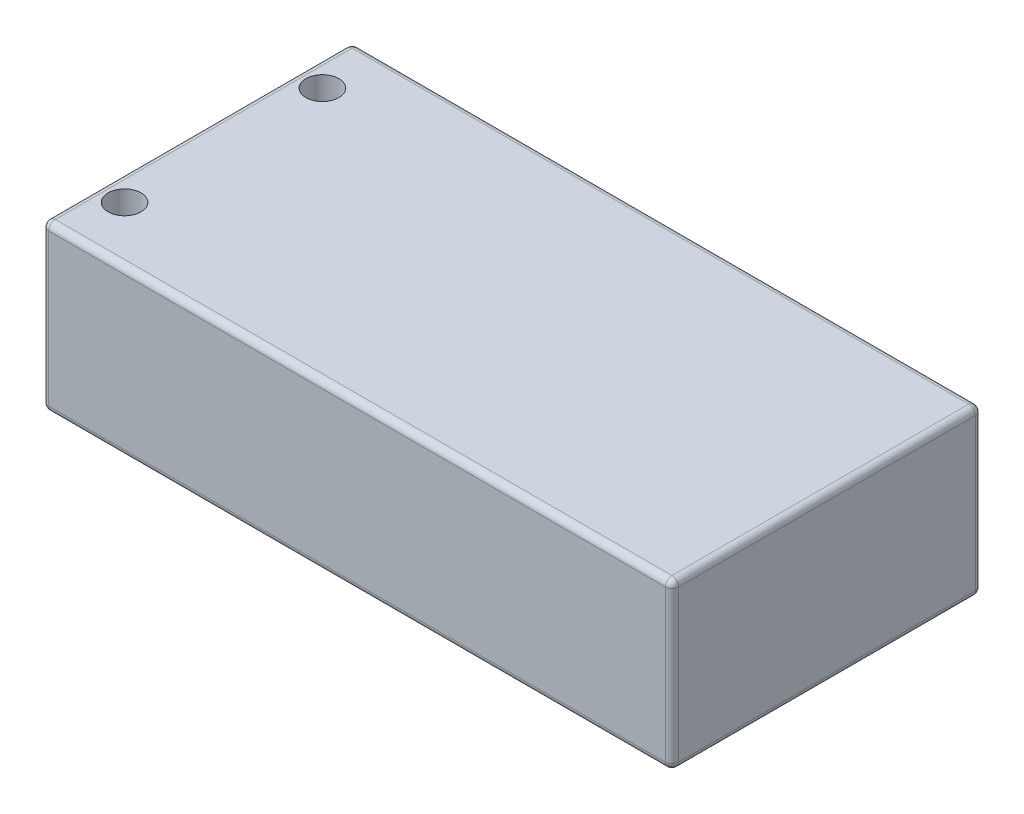
ISO-10303-21;
HEADER;
FILE_DESCRIPTION(('STEP AP214'),'2;1');
FILE_NAME('part.step','',(''),(''),'','','');
FILE_SCHEMA(('AUTOMOTIVE_DESIGN { 1 0 10303 214 1 1 1 1 }'));
ENDSEC;
DATA;
#1=APPLICATION_CONTEXT('core data for automotive mechanical design processes');
#2=APPLICATION_PROTOCOL_DEFINITION('international standard','automotive_design',2000,#1);
#3=PRODUCT_CONTEXT('',#1,'mechanical');
#4=PRODUCT('Part','Part','',(#3));
#5=PRODUCT_RELATED_PRODUCT_CATEGORY('part','',(#4));
#6=PRODUCT_DEFINITION_FORMATION('','',#4);
#7=PRODUCT_DEFINITION_CONTEXT('part definition',#1,'design');
#8=PRODUCT_DEFINITION('design','',#6,#7);
#9=PRODUCT_DEFINITION_SHAPE('','',#8);
#10=(LENGTH_UNIT() NAMED_UNIT(*) SI_UNIT(.MILLI.,.METRE.));
#11=(NAMED_UNIT(*) PLANE_ANGLE_UNIT() SI_UNIT($,.RADIAN.));
#12=(NAMED_UNIT(*) SI_UNIT($,.STERADIAN.) SOLID_ANGLE_UNIT());
#13=UNCERTAINTY_MEASURE_WITH_UNIT(LENGTH_MEASURE(1.E-05),#10,'distance_accuracy_value','');
#14=(GEOMETRIC_REPRESENTATION_CONTEXT(3) GLOBAL_UNCERTAINTY_ASSIGNED_CONTEXT((#13)) GLOBAL_UNIT_ASSIGNED_CONTEXT((#10,
#11,#12)) REPRESENTATION_CONTEXT('',''));
#15=CARTESIAN_POINT('',(0.,0.,0.));
#16=DIRECTION('',(0.,0.,1.));
#17=DIRECTION('',(1.,0.,0.));
#18=AXIS2_PLACEMENT_3D('',#15,#16,#17);
#19=CARTESIAN_POINT('',(47.75,25.,23.5));
#20=DIRECTION('',(-1.,0.,0.));
#21=DIRECTION('',(0.,0.,1.));
#22=AXIS2_PLACEMENT_3D('',#19,#20,#21);
#23=PLANE('',#22);
#24=DIRECTION('',(0.,0.,-1.));
#25=VECTOR('',#24,1.);
#26=CARTESIAN_POINT('',(47.75,24.,23.5));
#27=LINE('',#26,#25);
#28=CARTESIAN_POINT('',(47.75,24.,-22.5));
#29=VERTEX_POINT('',#28);
#30=CARTESIAN_POINT('',(47.75,24.,22.5));
#31=VERTEX_POINT('',#30);
#32=EDGE_CURVE('E253',#29,#31,#27,.F.);
#33=ORIENTED_EDGE('',*,*,#32,.T.);
#34=DIRECTION('',(0.,-1.,0.));
#35=VECTOR('',#34,1.);
#36=CARTESIAN_POINT('',(47.75,25.,22.5));
#37=LINE('',#36,#35);
#38=CARTESIAN_POINT('',(47.75,1.,22.5));
#39=VERTEX_POINT('',#38);
#40=EDGE_CURVE('E257',#31,#39,#37,.T.);
#41=ORIENTED_EDGE('',*,*,#40,.T.);
#42=DIRECTION('',(0.,0.,-1.));
#43=VECTOR('',#42,1.);
#44=CARTESIAN_POINT('',(47.75,1.,-23.5));
#45=LINE('',#44,#43);
#46=CARTESIAN_POINT('',(47.75,1.,-22.5));
#47=VERTEX_POINT('',#46);
#48=EDGE_CURVE('E250',#39,#47,#45,.T.);
#49=ORIENTED_EDGE('',*,*,#48,.T.);
#50=DIRECTION('',(0.,-1.,0.));
#51=VECTOR('',#50,1.);
#52=CARTESIAN_POINT('',(47.75,25.,-22.5));
#53=LINE('',#52,#51);
#54=EDGE_CURVE('E247',#47,#29,#53,.F.);
#55=ORIENTED_EDGE('',*,*,#54,.T.);
#56=EDGE_LOOP('',(#33,#41,#49,#55));
#57=FACE_BOUND('',#56,.T.);
#58=ADVANCED_FACE('F38',(#57),#23,.F.);
#59=CARTESIAN_POINT('',(-47.75,25.,-23.5));
#60=DIRECTION('',(0.,0.,1.));
#61=DIRECTION('',(1.,0.,0.));
#62=AXIS2_PLACEMENT_3D('',#59,#60,#61);
#63=PLANE('',#62);
#64=DIRECTION('',(-1.,0.,0.));
#65=VECTOR('',#64,1.);
#66=CARTESIAN_POINT('',(-47.75,24.,-23.5));
#67=LINE('',#66,#65);
#68=CARTESIAN_POINT('',(-46.75,24.,-23.5));
#69=VERTEX_POINT('',#68);
#70=CARTESIAN_POINT('',(46.75,24.,-23.5));
#71=VERTEX_POINT('',#70);
#72=EDGE_CURVE('E163',#69,#71,#67,.F.);
#73=ORIENTED_EDGE('',*,*,#72,.T.);
#74=DIRECTION('',(0.,-1.,0.));
#75=VECTOR('',#74,1.);
#76=CARTESIAN_POINT('',(46.75,25.,-23.5));
#77=LINE('',#76,#75);
#78=CARTESIAN_POINT('',(46.75,1.,-23.5));
#79=VERTEX_POINT('',#78);
#80=EDGE_CURVE('E294',#71,#79,#77,.T.);
#81=ORIENTED_EDGE('',*,*,#80,.T.);
#82=DIRECTION('',(-1.,0.,0.));
#83=VECTOR('',#82,1.);
#84=CARTESIAN_POINT('',(-47.75,1.,-23.5));
#85=LINE('',#84,#83);
#86=CARTESIAN_POINT('',(-46.75,1.,-23.5));
#87=VERTEX_POINT('',#86);
#88=EDGE_CURVE('E289',#79,#87,#85,.T.);
#89=ORIENTED_EDGE('',*,*,#88,.T.);
#90=DIRECTION('',(0.,-1.,0.));
#91=VECTOR('',#90,1.);
#92=CARTESIAN_POINT('',(-46.75,25.,-23.5));
#93=LINE('',#92,#91);
#94=EDGE_CURVE('E286',#87,#69,#93,.F.);
#95=ORIENTED_EDGE('',*,*,#94,.T.);
#96=EDGE_LOOP('',(#73,#81,#89,#95));
#97=FACE_BOUND('',#96,.T.);
#98=ADVANCED_FACE('F349',(#97),#63,.F.);
#99=CARTESIAN_POINT('',(-47.75,25.,23.5));
#100=DIRECTION('',(1.,0.,0.));
#101=DIRECTION('',(0.,0.,-1.));
#102=AXIS2_PLACEMENT_3D('',#99,#100,#101);
#103=PLANE('',#102);
#104=DIRECTION('',(0.,0.,1.));
#105=VECTOR('',#104,1.);
#106=CARTESIAN_POINT('',(-47.75,24.,23.5));
#107=LINE('',#106,#105);
#108=CARTESIAN_POINT('',(-47.75,24.,22.5));
#109=VERTEX_POINT('',#108);
#110=CARTESIAN_POINT('',(-47.75,24.,-22.5));
#111=VERTEX_POINT('',#110);
#112=EDGE_CURVE('E48',#109,#111,#107,.F.);
#113=ORIENTED_EDGE('',*,*,#112,.T.);
#114=DIRECTION('',(0.,-1.,0.));
#115=VECTOR('',#114,1.);
#116=CARTESIAN_POINT('',(-47.75,25.,-22.5));
#117=LINE('',#116,#115);
#118=CARTESIAN_POINT('',(-47.75,1.,-22.5));
#119=VERTEX_POINT('',#118);
#120=EDGE_CURVE('E11',#111,#119,#117,.T.);
#121=ORIENTED_EDGE('',*,*,#120,.T.);
#122=DIRECTION('',(0.,0.,1.));
#123=VECTOR('',#122,1.);
#124=CARTESIAN_POINT('',(-47.75,1.,23.5));
#125=LINE('',#124,#123);
#126=CARTESIAN_POINT('',(-47.75,1.,22.5));
#127=VERTEX_POINT('',#126);
#128=EDGE_CURVE('E298',#119,#127,#125,.T.);
#129=ORIENTED_EDGE('',*,*,#128,.T.);
#130=DIRECTION('',(0.,-1.,0.));
#131=VECTOR('',#130,1.);
#132=CARTESIAN_POINT('',(-47.75,25.,22.5));
#133=LINE('',#132,#131);
#134=EDGE_CURVE('E59',#127,#109,#133,.F.);
#135=ORIENTED_EDGE('',*,*,#134,.T.);
#136=EDGE_LOOP('',(#113,#121,#129,#135));
#137=FACE_BOUND('',#136,.T.);
#138=ADVANCED_FACE('F354',(#137),#103,.F.);
#139=CARTESIAN_POINT('',(-47.75,25.,23.5));
#140=DIRECTION('',(0.,0.,-1.));
#141=DIRECTION('',(-1.,0.,0.));
#142=AXIS2_PLACEMENT_3D('',#139,#140,#141);
#143=PLANE('',#142);
#144=DIRECTION('',(0.,-1.,0.));
#145=VECTOR('',#144,1.);
#146=CARTESIAN_POINT('',(46.75,25.,23.5));
#147=LINE('',#146,#145);
#148=CARTESIAN_POINT('',(46.75,1.,23.5));
#149=VERTEX_POINT('',#148);
#150=CARTESIAN_POINT('',(46.75,24.,23.5));
#151=VERTEX_POINT('',#150);
#152=EDGE_CURVE('E279',#149,#151,#147,.F.);
#153=ORIENTED_EDGE('',*,*,#152,.T.);
#154=DIRECTION('',(1.,0.,0.));
#155=VECTOR('',#154,1.);
#156=CARTESIAN_POINT('',(-47.75,24.,23.5));
#157=LINE('',#156,#155);
#158=CARTESIAN_POINT('',(-46.75,24.,23.5));
#159=VERTEX_POINT('',#158);
#160=EDGE_CURVE('E282',#151,#159,#157,.F.);
#161=ORIENTED_EDGE('',*,*,#160,.T.);
#162=DIRECTION('',(0.,-1.,0.));
#163=VECTOR('',#162,1.);
#164=CARTESIAN_POINT('',(-46.75,25.,23.5));
#165=LINE('',#164,#163);
#166=CARTESIAN_POINT('',(-46.75,1.,23.5));
#167=VERTEX_POINT('',#166);
#168=EDGE_CURVE('E273',#159,#167,#165,.T.);
#169=ORIENTED_EDGE('',*,*,#168,.T.);
#170=DIRECTION('',(1.,0.,0.));
#171=VECTOR('',#170,1.);
#172=CARTESIAN_POINT('',(47.75,1.,23.5));
#173=LINE('',#172,#171);
#174=EDGE_CURVE('E276',#167,#149,#173,.T.);
#175=ORIENTED_EDGE('',*,*,#174,.T.);
#176=EDGE_LOOP('',(#153,#161,#169,#175));
#177=FACE_BOUND('',#176,.T.);
#178=ADVANCED_FACE('F370',(#177),#143,.F.);
#179=CARTESIAN_POINT('',(0.,25.,0.));
#180=DIRECTION('',(0.,-1.,0.));
#181=DIRECTION('',(0.,0.,-1.));
#182=AXIS2_PLACEMENT_3D('',#179,#180,#181);
#183=PLANE('',#182);
#184=DIRECTION('',(1.,0.,0.));
#185=VECTOR('',#184,1.);
#186=CARTESIAN_POINT('',(0.,25.,22.5));
#187=LINE('',#186,#185);
#188=CARTESIAN_POINT('',(-46.75,25.,22.5));
#189=VERTEX_POINT('',#188);
#190=CARTESIAN_POINT('',(46.75,25.,22.5));
#191=VERTEX_POINT('',#190);
#192=EDGE_CURVE('E139',#189,#191,#187,.T.);
#193=ORIENTED_EDGE('',*,*,#192,.T.);
#194=DIRECTION('',(0.,0.,-1.));
#195=VECTOR('',#194,1.);
#196=CARTESIAN_POINT('',(46.75,25.,0.));
#197=LINE('',#196,#195);
#198=CARTESIAN_POINT('',(46.75,25.,-22.5));
#199=VERTEX_POINT('',#198);
#200=EDGE_CURVE('E134',#191,#199,#197,.T.);
#201=ORIENTED_EDGE('',*,*,#200,.T.);
#202=DIRECTION('',(-1.,0.,0.));
#203=VECTOR('',#202,1.);
#204=CARTESIAN_POINT('',(0.,25.,-22.5));
#205=LINE('',#204,#203);
#206=CARTESIAN_POINT('',(-46.75,25.,-22.5));
#207=VERTEX_POINT('',#206);
#208=EDGE_CURVE('E127',#199,#207,#205,.T.);
#209=ORIENTED_EDGE('',*,*,#208,.T.);
#210=DIRECTION('',(0.,0.,1.));
#211=VECTOR('',#210,1.);
#212=CARTESIAN_POINT('',(-46.75,25.,0.));
#213=LINE('',#212,#211);
#214=EDGE_CURVE('E131',#207,#189,#213,.T.);
#215=ORIENTED_EDGE('',*,*,#214,.T.);
#216=EDGE_LOOP('',(#193,#201,#209,#215));
#217=FACE_BOUND('',#216,.T.);
#218=CARTESIAN_POINT('',(-43.75,25.,-15.));
#219=DIRECTION('',(0.,1.,0.));
#220=DIRECTION('',(0.,0.,1.));
#221=AXIS2_PLACEMENT_3D('',#218,#219,#220);
#222=CIRCLE('',#221,2.5);
#223=CARTESIAN_POINT('',(-43.75,25.,-12.5));
#224=VERTEX_POINT('',#223);
#225=EDGE_CURVE('E239',#224,#224,#222,.T.);
#226=ORIENTED_EDGE('',*,*,#225,.F.);
#227=EDGE_LOOP('',(#226));
#228=FACE_BOUND('',#227,.T.);
#229=CARTESIAN_POINT('',(-43.75,25.,15.));
#230=DIRECTION('',(0.,1.,0.));
#231=DIRECTION('',(0.,0.,1.));
#232=AXIS2_PLACEMENT_3D('',#229,#230,#231);
#233=CIRCLE('',#232,2.5);
#234=CARTESIAN_POINT('',(-43.75,25.,17.5));
#235=VERTEX_POINT('',#234);
#236=EDGE_CURVE('E226',#235,#235,#233,.T.);
#237=ORIENTED_EDGE('',*,*,#236,.F.);
#238=EDGE_LOOP('',(#237));
#239=FACE_BOUND('',#238,.T.);
#240=ADVANCED_FACE('F129',(#217,#228,#239),#183,.F.);
#241=CARTESIAN_POINT('',(0.,0.,0.));
#242=DIRECTION('',(0.,-1.,0.));
#243=DIRECTION('',(0.,0.,-1.));
#244=AXIS2_PLACEMENT_3D('',#241,#242,#243);
#245=PLANE('',#244);
#246=DIRECTION('',(-1.,0.,0.));
#247=VECTOR('',#246,1.);
#248=CARTESIAN_POINT('',(47.75,0.,-22.5));
#249=LINE('',#248,#247);
#250=CARTESIAN_POINT('',(-46.75,0.,-22.5));
#251=VERTEX_POINT('',#250);
#252=CARTESIAN_POINT('',(46.75,0.,-22.5));
#253=VERTEX_POINT('',#252);
#254=EDGE_CURVE('E263',#251,#253,#249,.F.);
#255=ORIENTED_EDGE('',*,*,#254,.T.);
#256=DIRECTION('',(0.,0.,-1.));
#257=VECTOR('',#256,1.);
#258=CARTESIAN_POINT('',(46.75,0.,23.5));
#259=LINE('',#258,#257);
#260=CARTESIAN_POINT('',(46.75,0.,22.5));
#261=VERTEX_POINT('',#260);
#262=EDGE_CURVE('E269',#253,#261,#259,.F.);
#263=ORIENTED_EDGE('',*,*,#262,.T.);
#264=DIRECTION('',(1.,0.,0.));
#265=VECTOR('',#264,1.);
#266=CARTESIAN_POINT('',(-47.75,0.,22.5));
#267=LINE('',#266,#265);
#268=CARTESIAN_POINT('',(-46.75,0.,22.5));
#269=VERTEX_POINT('',#268);
#270=EDGE_CURVE('E266',#261,#269,#267,.F.);
#271=ORIENTED_EDGE('',*,*,#270,.T.);
#272=DIRECTION('',(0.,0.,1.));
#273=VECTOR('',#272,1.);
#274=CARTESIAN_POINT('',(-46.75,0.,-23.5));
#275=LINE('',#274,#273);
#276=EDGE_CURVE('E260',#269,#251,#275,.F.);
#277=ORIENTED_EDGE('',*,*,#276,.T.);
#278=EDGE_LOOP('',(#255,#263,#271,#277));
#279=FACE_BOUND('',#278,.T.);
#280=ADVANCED_FACE('F587',(#279),#245,.T.);
#281=CARTESIAN_POINT('',(-43.75,5.,15.));
#282=DIRECTION('',(0.,1.,0.));
#283=DIRECTION('',(0.,0.,1.));
#284=AXIS2_PLACEMENT_3D('',#281,#282,#283);
#285=CYLINDRICAL_SURFACE('',#284,2.5);
#286=CARTESIAN_POINT('',(-43.75,5.,15.));
#287=DIRECTION('',(0.,1.,0.));
#288=DIRECTION('',(0.,0.,1.));
#289=AXIS2_PLACEMENT_3D('',#286,#287,#288);
#290=CIRCLE('',#289,2.5);
#291=CARTESIAN_POINT('',(-43.75,5.,17.5));
#292=VERTEX_POINT('',#291);
#293=EDGE_CURVE('E233',#292,#292,#290,.T.);
#294=ORIENTED_EDGE('',*,*,#293,.F.);
#295=EDGE_LOOP('',(#294));
#296=FACE_BOUND('',#295,.T.);
#297=ORIENTED_EDGE('',*,*,#236,.T.);
#298=EDGE_LOOP('',(#297));
#299=FACE_BOUND('',#298,.T.);
#300=ADVANCED_FACE('F578',(#296,#299),#285,.F.);
#301=CARTESIAN_POINT('',(-43.75,5.,15.));
#302=DIRECTION('',(0.,1.,0.));
#303=DIRECTION('',(0.,0.,1.));
#304=AXIS2_PLACEMENT_3D('',#301,#302,#303);
#305=PLANE('',#304);
#306=ORIENTED_EDGE('',*,*,#293,.T.);
#307=EDGE_LOOP('',(#306));
#308=FACE_BOUND('',#307,.T.);
#309=ADVANCED_FACE('F569',(#308),#305,.T.);
#310=CARTESIAN_POINT('',(-43.75,5.,-15.));
#311=DIRECTION('',(0.,1.,0.));
#312=DIRECTION('',(0.,0.,1.));
#313=AXIS2_PLACEMENT_3D('',#310,#311,#312);
#314=CYLINDRICAL_SURFACE('',#313,2.5);
#315=CARTESIAN_POINT('',(-43.75,5.,-15.));
#316=DIRECTION('',(0.,1.,0.));
#317=DIRECTION('',(0.,0.,1.));
#318=AXIS2_PLACEMENT_3D('',#315,#316,#317);
#319=CIRCLE('',#318,2.5);
#320=CARTESIAN_POINT('',(-43.75,5.,-12.5));
#321=VERTEX_POINT('',#320);
#322=EDGE_CURVE('E151',#321,#321,#319,.T.);
#323=ORIENTED_EDGE('',*,*,#322,.F.);
#324=EDGE_LOOP('',(#323));
#325=FACE_BOUND('',#324,.T.);
#326=ORIENTED_EDGE('',*,*,#225,.T.);
#327=EDGE_LOOP('',(#326));
#328=FACE_BOUND('',#327,.T.);
#329=ADVANCED_FACE('F560',(#325,#328),#314,.F.);
#330=CARTESIAN_POINT('',(-43.75,5.,-15.));
#331=DIRECTION('',(0.,1.,0.));
#332=DIRECTION('',(0.,0.,1.));
#333=AXIS2_PLACEMENT_3D('',#330,#331,#332);
#334=PLANE('',#333);
#335=ORIENTED_EDGE('',*,*,#322,.T.);
#336=EDGE_LOOP('',(#335));
#337=FACE_BOUND('',#336,.T.);
#338=ADVANCED_FACE('F552',(#337),#334,.T.);
#339=CARTESIAN_POINT('',(-46.75,1.,23.5));
#340=DIRECTION('',(0.,0.,-1.));
#341=DIRECTION('',(-1.,0.,0.));
#342=AXIS2_PLACEMENT_3D('',#339,#340,#341);
#343=CYLINDRICAL_SURFACE('',#342,1.);
#344=CARTESIAN_POINT('',(-46.75,1.,22.5));
#345=DIRECTION('',(0.,0.,1.));
#346=DIRECTION('',(1.,0.,0.));
#347=AXIS2_PLACEMENT_3D('',#344,#345,#346);
#348=CIRCLE('',#347,1.);
#349=EDGE_CURVE('E42',#127,#269,#348,.T.);
#350=ORIENTED_EDGE('',*,*,#349,.F.);
#351=ORIENTED_EDGE('',*,*,#128,.F.);
#352=CARTESIAN_POINT('',(-46.75,1.,-22.5));
#353=DIRECTION('',(0.,0.,-1.));
#354=DIRECTION('',(-1.,0.,0.));
#355=AXIS2_PLACEMENT_3D('',#352,#353,#354);
#356=CIRCLE('',#355,1.);
#357=EDGE_CURVE('E216',#251,#119,#356,.T.);
#358=ORIENTED_EDGE('',*,*,#357,.F.);
#359=ORIENTED_EDGE('',*,*,#276,.F.);
#360=EDGE_LOOP('',(#350,#351,#358,#359));
#361=FACE_BOUND('',#360,.T.);
#362=ADVANCED_FACE('F40',(#361),#343,.T.);
#363=CARTESIAN_POINT('',(-46.75,1.,22.5));
#364=DIRECTION('',(0.,0.,1.));
#365=DIRECTION('',(1.,0.,0.));
#366=AXIS2_PLACEMENT_3D('',#363,#364,#365);
#367=SPHERICAL_SURFACE('',#366,1.);
#368=CARTESIAN_POINT('',(-46.75,1.,22.5));
#369=DIRECTION('',(0.,-1.,0.));
#370=DIRECTION('',(0.,0.,-1.));
#371=AXIS2_PLACEMENT_3D('',#368,#369,#370);
#372=CIRCLE('',#371,1.);
#373=EDGE_CURVE('E209',#127,#167,#372,.F.);
#374=ORIENTED_EDGE('',*,*,#373,.F.);
#375=ORIENTED_EDGE('',*,*,#349,.T.);
#376=CARTESIAN_POINT('',(-46.75,1.,22.5));
#377=DIRECTION('',(-1.,0.,0.));
#378=DIRECTION('',(0.,0.,1.));
#379=AXIS2_PLACEMENT_3D('',#376,#377,#378);
#380=CIRCLE('',#379,1.);
#381=EDGE_CURVE('E213',#167,#269,#380,.F.);
#382=ORIENTED_EDGE('',*,*,#381,.F.);
#383=EDGE_LOOP('',(#374,#375,#382));
#384=FACE_BOUND('',#383,.T.);
#385=ADVANCED_FACE('F357',(#384),#367,.T.);
#386=CARTESIAN_POINT('',(-46.75,1.,-22.5));
#387=DIRECTION('',(0.,0.,1.));
#388=DIRECTION('',(1.,0.,0.));
#389=AXIS2_PLACEMENT_3D('',#386,#387,#388);
#390=SPHERICAL_SURFACE('',#389,1.);
#391=CARTESIAN_POINT('',(-46.75,1.,-22.5));
#392=DIRECTION('',(-1.,0.,0.));
#393=DIRECTION('',(0.,0.,1.));
#394=AXIS2_PLACEMENT_3D('',#391,#392,#393);
#395=CIRCLE('',#394,1.);
#396=EDGE_CURVE('E202',#251,#87,#395,.F.);
#397=ORIENTED_EDGE('',*,*,#396,.F.);
#398=ORIENTED_EDGE('',*,*,#357,.T.);
#399=CARTESIAN_POINT('',(-46.75,1.,-22.5));
#400=DIRECTION('',(0.,-1.,0.));
#401=DIRECTION('',(0.,0.,-1.));
#402=AXIS2_PLACEMENT_3D('',#399,#400,#401);
#403=CIRCLE('',#402,1.);
#404=EDGE_CURVE('E206',#87,#119,#403,.F.);
#405=ORIENTED_EDGE('',*,*,#404,.F.);
#406=EDGE_LOOP('',(#397,#398,#405));
#407=FACE_BOUND('',#406,.T.);
#408=ADVANCED_FACE('F388',(#407),#390,.T.);
#409=CARTESIAN_POINT('',(-47.75,1.,22.5));
#410=DIRECTION('',(-1.,0.,0.));
#411=DIRECTION('',(0.,0.,1.));
#412=AXIS2_PLACEMENT_3D('',#409,#410,#411);
#413=CYLINDRICAL_SURFACE('',#412,1.);
#414=ORIENTED_EDGE('',*,*,#381,.T.);
#415=ORIENTED_EDGE('',*,*,#270,.F.);
#416=CARTESIAN_POINT('',(46.75,1.,22.5));
#417=DIRECTION('',(1.,0.,0.));
#418=DIRECTION('',(0.,0.,-1.));
#419=AXIS2_PLACEMENT_3D('',#416,#417,#418);
#420=CIRCLE('',#419,1.);
#421=EDGE_CURVE('E195',#149,#261,#420,.T.);
#422=ORIENTED_EDGE('',*,*,#421,.F.);
#423=ORIENTED_EDGE('',*,*,#174,.F.);
#424=EDGE_LOOP('',(#414,#415,#422,#423));
#425=FACE_BOUND('',#424,.T.);
#426=ADVANCED_FACE('F374',(#425),#413,.T.);
#427=CARTESIAN_POINT('',(-46.75,25.,22.5));
#428=DIRECTION('',(0.,-1.,0.));
#429=DIRECTION('',(0.,0.,-1.));
#430=AXIS2_PLACEMENT_3D('',#427,#428,#429);
#431=CYLINDRICAL_SURFACE('',#430,1.);
#432=ORIENTED_EDGE('',*,*,#373,.T.);
#433=ORIENTED_EDGE('',*,*,#168,.F.);
#434=CARTESIAN_POINT('',(-46.75,24.,22.5));
#435=DIRECTION('',(0.,1.,0.));
#436=DIRECTION('',(0.,0.,1.));
#437=AXIS2_PLACEMENT_3D('',#434,#435,#436);
#438=CIRCLE('',#437,1.);
#439=EDGE_CURVE('E191',#109,#159,#438,.T.);
#440=ORIENTED_EDGE('',*,*,#439,.F.);
#441=ORIENTED_EDGE('',*,*,#134,.F.);
#442=EDGE_LOOP('',(#432,#433,#440,#441));
#443=FACE_BOUND('',#442,.T.);
#444=ADVANCED_FACE('F362',(#443),#431,.T.);
#445=CARTESIAN_POINT('',(-46.75,24.,0.));
#446=DIRECTION('',(0.,0.,1.));
#447=DIRECTION('',(1.,0.,0.));
#448=AXIS2_PLACEMENT_3D('',#445,#446,#447);
#449=CYLINDRICAL_SURFACE('',#448,1.);
#450=CARTESIAN_POINT('',(-46.75,24.,-22.5));
#451=DIRECTION('',(0.,0.,-1.));
#452=DIRECTION('',(-1.,0.,0.));
#453=AXIS2_PLACEMENT_3D('',#450,#451,#452);
#454=CIRCLE('',#453,1.);
#455=EDGE_CURVE('E145',#111,#207,#454,.T.);
#456=ORIENTED_EDGE('',*,*,#455,.F.);
#457=ORIENTED_EDGE('',*,*,#112,.F.);
#458=CARTESIAN_POINT('',(-46.75,24.,22.5));
#459=DIRECTION('',(0.,0.,1.));
#460=DIRECTION('',(1.,0.,0.));
#461=AXIS2_PLACEMENT_3D('',#458,#459,#460);
#462=CIRCLE('',#461,1.);
#463=EDGE_CURVE('E148',#189,#109,#462,.T.);
#464=ORIENTED_EDGE('',*,*,#463,.F.);
#465=ORIENTED_EDGE('',*,*,#214,.F.);
#466=EDGE_LOOP('',(#456,#457,#464,#465));
#467=FACE_BOUND('',#466,.T.);
#468=ADVANCED_FACE('F144',(#467),#449,.T.);
#469=CARTESIAN_POINT('',(-46.75,25.,-22.5));
#470=DIRECTION('',(0.,-1.,0.));
#471=DIRECTION('',(0.,0.,-1.));
#472=AXIS2_PLACEMENT_3D('',#469,#470,#471);
#473=CYLINDRICAL_SURFACE('',#472,1.);
#474=ORIENTED_EDGE('',*,*,#404,.T.);
#475=ORIENTED_EDGE('',*,*,#120,.F.);
#476=CARTESIAN_POINT('',(-46.75,24.,-22.5));
#477=DIRECTION('',(0.,1.,0.));
#478=DIRECTION('',(0.,0.,1.));
#479=AXIS2_PLACEMENT_3D('',#476,#477,#478);
#480=CIRCLE('',#479,1.);
#481=EDGE_CURVE('E159',#69,#111,#480,.T.);
#482=ORIENTED_EDGE('',*,*,#481,.F.);
#483=ORIENTED_EDGE('',*,*,#94,.F.);
#484=EDGE_LOOP('',(#474,#475,#482,#483));
#485=FACE_BOUND('',#484,.T.);
#486=ADVANCED_FACE('F353',(#485),#473,.T.);
#487=CARTESIAN_POINT('',(-47.75,1.,-22.5));
#488=DIRECTION('',(1.,0.,0.));
#489=DIRECTION('',(0.,0.,-1.));
#490=AXIS2_PLACEMENT_3D('',#487,#488,#489);
#491=CYLINDRICAL_SURFACE('',#490,1.);
#492=ORIENTED_EDGE('',*,*,#396,.T.);
#493=ORIENTED_EDGE('',*,*,#88,.F.);
#494=CARTESIAN_POINT('',(46.75,1.,-22.5));
#495=DIRECTION('',(1.,0.,0.));
#496=DIRECTION('',(0.,0.,-1.));
#497=AXIS2_PLACEMENT_3D('',#494,#495,#496);
#498=CIRCLE('',#497,1.);
#499=EDGE_CURVE('E183',#253,#79,#498,.T.);
#500=ORIENTED_EDGE('',*,*,#499,.F.);
#501=ORIENTED_EDGE('',*,*,#254,.F.);
#502=EDGE_LOOP('',(#492,#493,#500,#501));
#503=FACE_BOUND('',#502,.T.);
#504=ADVANCED_FACE('F387',(#503),#491,.T.);
#505=CARTESIAN_POINT('',(46.75,1.,23.5));
#506=DIRECTION('',(0.,0.,1.));
#507=DIRECTION('',(1.,0.,0.));
#508=AXIS2_PLACEMENT_3D('',#505,#506,#507);
#509=CYLINDRICAL_SURFACE('',#508,1.);
#510=CARTESIAN_POINT('',(46.75,1.,22.5));
#511=DIRECTION('',(0.,0.,1.));
#512=DIRECTION('',(1.,0.,0.));
#513=AXIS2_PLACEMENT_3D('',#510,#511,#512);
#514=CIRCLE('',#513,1.);
#515=EDGE_CURVE('E198',#261,#39,#514,.T.);
#516=ORIENTED_EDGE('',*,*,#515,.F.);
#517=ORIENTED_EDGE('',*,*,#262,.F.);
#518=CARTESIAN_POINT('',(46.75,1.,-22.5));
#519=DIRECTION('',(0.,0.,-1.));
#520=DIRECTION('',(-1.,0.,0.));
#521=AXIS2_PLACEMENT_3D('',#518,#519,#520);
#522=CIRCLE('',#521,1.);
#523=EDGE_CURVE('E179',#47,#253,#522,.T.);
#524=ORIENTED_EDGE('',*,*,#523,.F.);
#525=ORIENTED_EDGE('',*,*,#48,.F.);
#526=EDGE_LOOP('',(#516,#517,#524,#525));
#527=FACE_BOUND('',#526,.T.);
#528=ADVANCED_FACE('F380',(#527),#509,.T.);
#529=CARTESIAN_POINT('',(46.75,1.,22.5));
#530=DIRECTION('',(0.,0.,1.));
#531=DIRECTION('',(1.,0.,0.));
#532=AXIS2_PLACEMENT_3D('',#529,#530,#531);
#533=SPHERICAL_SURFACE('',#532,1.);
#534=ORIENTED_EDGE('',*,*,#421,.T.);
#535=ORIENTED_EDGE('',*,*,#515,.T.);
#536=CARTESIAN_POINT('',(46.75,1.,22.5));
#537=DIRECTION('',(0.,-1.,0.));
#538=DIRECTION('',(0.,0.,-1.));
#539=AXIS2_PLACEMENT_3D('',#536,#537,#538);
#540=CIRCLE('',#539,1.);
#541=EDGE_CURVE('E170',#149,#39,#540,.F.);
#542=ORIENTED_EDGE('',*,*,#541,.F.);
#543=EDGE_LOOP('',(#534,#535,#542));
#544=FACE_BOUND('',#543,.T.);
#545=ADVANCED_FACE('F377',(#544),#533,.T.);
#546=CARTESIAN_POINT('',(-46.75,24.,22.5));
#547=DIRECTION('',(0.,0.,1.));
#548=DIRECTION('',(1.,0.,0.));
#549=AXIS2_PLACEMENT_3D('',#546,#547,#548);
#550=SPHERICAL_SURFACE('',#549,1.);
#551=ORIENTED_EDGE('',*,*,#463,.T.);
#552=ORIENTED_EDGE('',*,*,#439,.T.);
#553=CARTESIAN_POINT('',(-46.75,24.,22.5));
#554=DIRECTION('',(-1.,0.,0.));
#555=DIRECTION('',(0.,0.,1.));
#556=AXIS2_PLACEMENT_3D('',#553,#554,#555);
#557=CIRCLE('',#556,1.);
#558=EDGE_CURVE('E165',#189,#159,#557,.F.);
#559=ORIENTED_EDGE('',*,*,#558,.F.);
#560=EDGE_LOOP('',(#551,#552,#559));
#561=FACE_BOUND('',#560,.T.);
#562=ADVANCED_FACE('F364',(#561),#550,.T.);
#563=CARTESIAN_POINT('',(-46.75,24.,-22.5));
#564=DIRECTION('',(0.,0.,1.));
#565=DIRECTION('',(1.,0.,0.));
#566=AXIS2_PLACEMENT_3D('',#563,#564,#565);
#567=SPHERICAL_SURFACE('',#566,1.);
#568=ORIENTED_EDGE('',*,*,#481,.T.);
#569=ORIENTED_EDGE('',*,*,#455,.T.);
#570=CARTESIAN_POINT('',(-46.75,24.,-22.5));
#571=DIRECTION('',(-1.,0.,0.));
#572=DIRECTION('',(0.,0.,1.));
#573=AXIS2_PLACEMENT_3D('',#570,#571,#572);
#574=CIRCLE('',#573,1.);
#575=EDGE_CURVE('E156',#69,#207,#574,.F.);
#576=ORIENTED_EDGE('',*,*,#575,.F.);
#577=EDGE_LOOP('',(#568,#569,#576));
#578=FACE_BOUND('',#577,.T.);
#579=ADVANCED_FACE('F155',(#578),#567,.T.);
#580=CARTESIAN_POINT('',(46.75,1.,-22.5));
#581=DIRECTION('',(0.,0.,1.));
#582=DIRECTION('',(1.,0.,0.));
#583=AXIS2_PLACEMENT_3D('',#580,#581,#582);
#584=SPHERICAL_SURFACE('',#583,1.);
#585=ORIENTED_EDGE('',*,*,#523,.T.);
#586=ORIENTED_EDGE('',*,*,#499,.T.);
#587=CARTESIAN_POINT('',(46.75,1.,-22.5));
#588=DIRECTION('',(0.,-1.,0.));
#589=DIRECTION('',(0.,0.,-1.));
#590=AXIS2_PLACEMENT_3D('',#587,#588,#589);
#591=CIRCLE('',#590,1.);
#592=EDGE_CURVE('E166',#47,#79,#591,.F.);
#593=ORIENTED_EDGE('',*,*,#592,.F.);
#594=EDGE_LOOP('',(#585,#586,#593));
#595=FACE_BOUND('',#594,.T.);
#596=ADVANCED_FACE('F384',(#595),#584,.T.);
#597=CARTESIAN_POINT('',(46.75,25.,22.5));
#598=DIRECTION('',(0.,-1.,0.));
#599=DIRECTION('',(0.,0.,-1.));
#600=AXIS2_PLACEMENT_3D('',#597,#598,#599);
#601=CYLINDRICAL_SURFACE('',#600,1.);
#602=ORIENTED_EDGE('',*,*,#541,.T.);
#603=ORIENTED_EDGE('',*,*,#40,.F.);
#604=CARTESIAN_POINT('',(46.75,24.,22.5));
#605=DIRECTION('',(0.,1.,0.));
#606=DIRECTION('',(0.,0.,1.));
#607=AXIS2_PLACEMENT_3D('',#604,#605,#606);
#608=CIRCLE('',#607,1.);
#609=EDGE_CURVE('E172',#151,#31,#608,.T.);
#610=ORIENTED_EDGE('',*,*,#609,.F.);
#611=ORIENTED_EDGE('',*,*,#152,.F.);
#612=EDGE_LOOP('',(#602,#603,#610,#611));
#613=FACE_BOUND('',#612,.T.);
#614=ADVANCED_FACE('F332',(#613),#601,.T.);
#615=CARTESIAN_POINT('',(0.,24.,22.5));
#616=DIRECTION('',(1.,0.,0.));
#617=DIRECTION('',(0.,0.,-1.));
#618=AXIS2_PLACEMENT_3D('',#615,#616,#617);
#619=CYLINDRICAL_SURFACE('',#618,1.);
#620=ORIENTED_EDGE('',*,*,#558,.T.);
#621=ORIENTED_EDGE('',*,*,#160,.F.);
#622=CARTESIAN_POINT('',(46.75,24.,22.5));
#623=DIRECTION('',(1.,0.,0.));
#624=DIRECTION('',(0.,0.,-1.));
#625=AXIS2_PLACEMENT_3D('',#622,#623,#624);
#626=CIRCLE('',#625,1.);
#627=EDGE_CURVE('E319',#191,#151,#626,.T.);
#628=ORIENTED_EDGE('',*,*,#627,.F.);
#629=ORIENTED_EDGE('',*,*,#192,.F.);
#630=EDGE_LOOP('',(#620,#621,#628,#629));
#631=FACE_BOUND('',#630,.T.);
#632=ADVANCED_FACE('F368',(#631),#619,.T.);
#633=CARTESIAN_POINT('',(0.,24.,-22.5));
#634=DIRECTION('',(-1.,0.,0.));
#635=DIRECTION('',(0.,0.,1.));
#636=AXIS2_PLACEMENT_3D('',#633,#634,#635);
#637=CYLINDRICAL_SURFACE('',#636,1.);
#638=ORIENTED_EDGE('',*,*,#575,.T.);
#639=ORIENTED_EDGE('',*,*,#208,.F.);
#640=CARTESIAN_POINT('',(46.75,24.,-22.5));
#641=DIRECTION('',(1.,0.,0.));
#642=DIRECTION('',(0.,0.,-1.));
#643=AXIS2_PLACEMENT_3D('',#640,#641,#642);
#644=CIRCLE('',#643,1.);
#645=EDGE_CURVE('E315',#71,#199,#644,.T.);
#646=ORIENTED_EDGE('',*,*,#645,.F.);
#647=ORIENTED_EDGE('',*,*,#72,.F.);
#648=EDGE_LOOP('',(#638,#639,#646,#647));
#649=FACE_BOUND('',#648,.T.);
#650=ADVANCED_FACE('F162',(#649),#637,.T.);
#651=CARTESIAN_POINT('',(46.75,25.,-22.5));
#652=DIRECTION('',(0.,-1.,0.));
#653=DIRECTION('',(0.,0.,-1.));
#654=AXIS2_PLACEMENT_3D('',#651,#652,#653);
#655=CYLINDRICAL_SURFACE('',#654,1.);
#656=ORIENTED_EDGE('',*,*,#592,.T.);
#657=ORIENTED_EDGE('',*,*,#80,.F.);
#658=CARTESIAN_POINT('',(46.75,24.,-22.5));
#659=DIRECTION('',(0.,1.,0.));
#660=DIRECTION('',(0.,0.,1.));
#661=AXIS2_PLACEMENT_3D('',#658,#659,#660);
#662=CIRCLE('',#661,1.);
#663=EDGE_CURVE('E311',#29,#71,#662,.T.);
#664=ORIENTED_EDGE('',*,*,#663,.F.);
#665=ORIENTED_EDGE('',*,*,#54,.F.);
#666=EDGE_LOOP('',(#656,#657,#664,#665));
#667=FACE_BOUND('',#666,.T.);
#668=ADVANCED_FACE('F346',(#667),#655,.T.);
#669=CARTESIAN_POINT('',(46.75,24.,22.5));
#670=DIRECTION('',(0.,0.,1.));
#671=DIRECTION('',(1.,0.,0.));
#672=AXIS2_PLACEMENT_3D('',#669,#670,#671);
#673=SPHERICAL_SURFACE('',#672,1.);
#674=ORIENTED_EDGE('',*,*,#627,.T.);
#675=ORIENTED_EDGE('',*,*,#609,.T.);
#676=CARTESIAN_POINT('',(46.75,24.,22.5));
#677=DIRECTION('',(0.,0.,1.));
#678=DIRECTION('',(1.,0.,0.));
#679=AXIS2_PLACEMENT_3D('',#676,#677,#678);
#680=CIRCLE('',#679,1.);
#681=EDGE_CURVE('E308',#191,#31,#680,.F.);
#682=ORIENTED_EDGE('',*,*,#681,.F.);
#683=EDGE_LOOP('',(#674,#675,#682));
#684=FACE_BOUND('',#683,.T.);
#685=ADVANCED_FACE('F328',(#684),#673,.T.);
#686=CARTESIAN_POINT('',(46.75,24.,-22.5));
#687=DIRECTION('',(0.,0.,1.));
#688=DIRECTION('',(1.,0.,0.));
#689=AXIS2_PLACEMENT_3D('',#686,#687,#688);
#690=SPHERICAL_SURFACE('',#689,1.);
#691=ORIENTED_EDGE('',*,*,#663,.T.);
#692=ORIENTED_EDGE('',*,*,#645,.T.);
#693=CARTESIAN_POINT('',(46.75,24.,-22.5));
#694=DIRECTION('',(0.,0.,-1.));
#695=DIRECTION('',(-1.,0.,0.));
#696=AXIS2_PLACEMENT_3D('',#693,#694,#695);
#697=CIRCLE('',#696,1.);
#698=EDGE_CURVE('E305',#29,#199,#697,.F.);
#699=ORIENTED_EDGE('',*,*,#698,.F.);
#700=EDGE_LOOP('',(#691,#692,#699));
#701=FACE_BOUND('',#700,.T.);
#702=ADVANCED_FACE('F343',(#701),#690,.T.);
#703=CARTESIAN_POINT('',(46.75,24.,0.));
#704=DIRECTION('',(0.,0.,-1.));
#705=DIRECTION('',(-1.,0.,0.));
#706=AXIS2_PLACEMENT_3D('',#703,#704,#705);
#707=CYLINDRICAL_SURFACE('',#706,1.);
#708=ORIENTED_EDGE('',*,*,#681,.T.);
#709=ORIENTED_EDGE('',*,*,#32,.F.);
#710=ORIENTED_EDGE('',*,*,#698,.T.);
#711=ORIENTED_EDGE('',*,*,#200,.F.);
#712=EDGE_LOOP('',(#708,#709,#710,#711));
#713=FACE_BOUND('',#712,.T.);
#714=ADVANCED_FACE('F341',(#713),#707,.T.);
#715=CLOSED_SHELL('',(#58,#98,#138,#178,#240,#280,#300,#309,#329,#338,#362,#385,#408,#426,#444,
#468,#486,#504,#528,#545,#562,#579,#596,#614,#632,#650,#668,#685,#702,#714));
#716=MANIFOLD_SOLID_BREP('B2',#715);
#717=ADVANCED_BREP_SHAPE_REPRESENTATION('',(#18,#716),#14);
#718=SHAPE_DEFINITION_REPRESENTATION(#9,#717);
ENDSEC;
END-ISO-10303-21;
